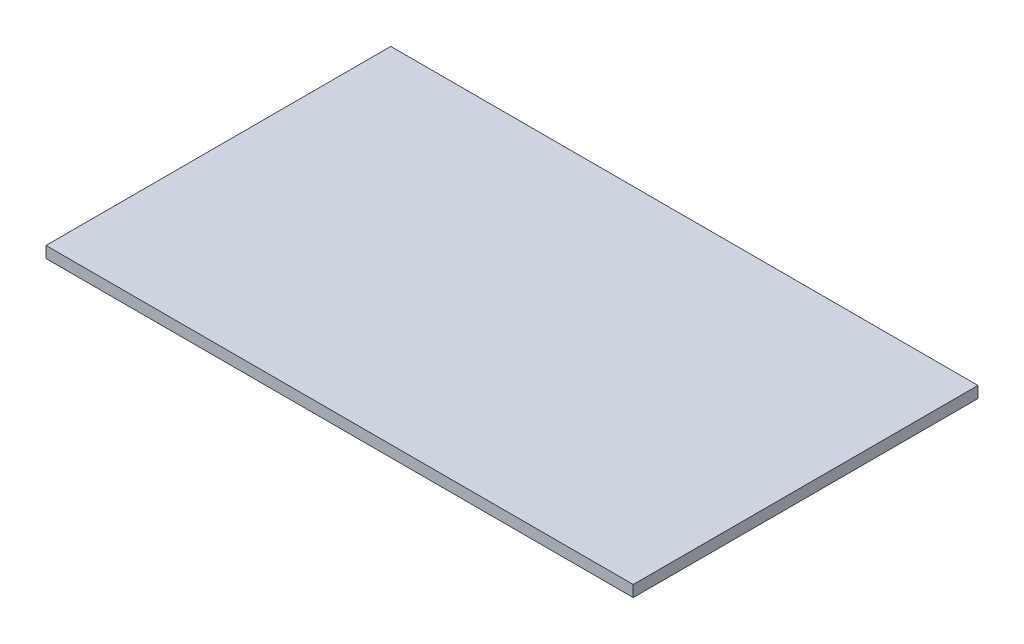
ISO-10303-21;
HEADER;
FILE_DESCRIPTION(('STEP AP214'),'2;1');
FILE_NAME('part.step','',(''),(''),'','','');
FILE_SCHEMA(('AUTOMOTIVE_DESIGN { 1 0 10303 214 1 1 1 1 }'));
ENDSEC;
DATA;
#1=APPLICATION_CONTEXT('core data for automotive mechanical design processes');
#2=APPLICATION_PROTOCOL_DEFINITION('international standard','automotive_design',2000,#1);
#3=PRODUCT_CONTEXT('',#1,'mechanical');
#4=PRODUCT('Part','Part','',(#3));
#5=PRODUCT_RELATED_PRODUCT_CATEGORY('part','',(#4));
#6=PRODUCT_DEFINITION_FORMATION('','',#4);
#7=PRODUCT_DEFINITION_CONTEXT('part definition',#1,'design');
#8=PRODUCT_DEFINITION('design','',#6,#7);
#9=PRODUCT_DEFINITION_SHAPE('','',#8);
#10=(LENGTH_UNIT() NAMED_UNIT(*) SI_UNIT(.MILLI.,.METRE.));
#11=(NAMED_UNIT(*) PLANE_ANGLE_UNIT() SI_UNIT($,.RADIAN.));
#12=(NAMED_UNIT(*) SI_UNIT($,.STERADIAN.) SOLID_ANGLE_UNIT());
#13=UNCERTAINTY_MEASURE_WITH_UNIT(LENGTH_MEASURE(1.E-05),#10,'distance_accuracy_value','');
#14=(GEOMETRIC_REPRESENTATION_CONTEXT(3) GLOBAL_UNCERTAINTY_ASSIGNED_CONTEXT((#13)) GLOBAL_UNIT_ASSIGNED_CONTEXT((#10,
#11,#12)) REPRESENTATION_CONTEXT('',''));
#15=CARTESIAN_POINT('',(0.,0.,0.));
#16=DIRECTION('',(0.,0.,1.));
#17=DIRECTION('',(1.,0.,0.));
#18=AXIS2_PLACEMENT_3D('',#15,#16,#17);
#19=CARTESIAN_POINT('',(0.,19.05,0.));
#20=DIRECTION('',(1.,0.,0.));
#21=DIRECTION('',(0.,0.,-1.));
#22=AXIS2_PLACEMENT_3D('',#19,#20,#21);
#23=PLANE('',#22);
#24=DIRECTION('',(0.,0.,1.));
#25=VECTOR('',#24,1.);
#26=CARTESIAN_POINT('',(0.,0.,0.));
#27=LINE('',#26,#25);
#28=CARTESIAN_POINT('',(-1.11022302462516E-13,0.,-577.85));
#29=VERTEX_POINT('',#28);
#30=CARTESIAN_POINT('',(0.,0.,0.));
#31=VERTEX_POINT('',#30);
#32=EDGE_CURVE('E96',#29,#31,#27,.T.);
#33=ORIENTED_EDGE('',*,*,#32,.T.);
#34=DIRECTION('',(0.,-1.,0.));
#35=VECTOR('',#34,1.);
#36=CARTESIAN_POINT('',(0.,19.05,0.));
#37=LINE('',#36,#35);
#38=CARTESIAN_POINT('',(0.,19.05,0.));
#39=VERTEX_POINT('',#38);
#40=EDGE_CURVE('E11',#39,#31,#37,.T.);
#41=ORIENTED_EDGE('',*,*,#40,.F.);
#42=DIRECTION('',(0.,0.,1.));
#43=VECTOR('',#42,1.);
#44=CARTESIAN_POINT('',(0.,19.05,0.));
#45=LINE('',#44,#43);
#46=CARTESIAN_POINT('',(-1.11022302462516E-13,19.05,-577.85));
#47=VERTEX_POINT('',#46);
#48=EDGE_CURVE('E84',#47,#39,#45,.T.);
#49=ORIENTED_EDGE('',*,*,#48,.F.);
#50=DIRECTION('',(0.,-1.,0.));
#51=VECTOR('',#50,1.);
#52=CARTESIAN_POINT('',(-1.11022302462516E-13,19.05,-577.85));
#53=LINE('',#52,#51);
#54=EDGE_CURVE('E92',#47,#29,#53,.T.);
#55=ORIENTED_EDGE('',*,*,#54,.T.);
#56=EDGE_LOOP('',(#33,#41,#49,#55));
#57=FACE_BOUND('',#56,.T.);
#58=ADVANCED_FACE('F33',(#57),#23,.F.);
#59=CARTESIAN_POINT('',(0.,19.05,0.));
#60=DIRECTION('',(0.,0.,-1.));
#61=DIRECTION('',(-1.,0.,0.));
#62=AXIS2_PLACEMENT_3D('',#59,#60,#61);
#63=PLANE('',#62);
#64=DIRECTION('',(1.,0.,0.));
#65=VECTOR('',#64,1.);
#66=CARTESIAN_POINT('',(0.,0.,0.));
#67=LINE('',#66,#65);
#68=CARTESIAN_POINT('',(984.25,0.,0.));
#69=VERTEX_POINT('',#68);
#70=EDGE_CURVE('E88',#31,#69,#67,.T.);
#71=ORIENTED_EDGE('',*,*,#70,.T.);
#72=DIRECTION('',(0.,-1.,0.));
#73=VECTOR('',#72,1.);
#74=CARTESIAN_POINT('',(984.25,19.05,0.));
#75=LINE('',#74,#73);
#76=CARTESIAN_POINT('',(984.25,19.05,0.));
#77=VERTEX_POINT('',#76);
#78=EDGE_CURVE('E41',#77,#69,#75,.T.);
#79=ORIENTED_EDGE('',*,*,#78,.F.);
#80=DIRECTION('',(1.,0.,0.));
#81=VECTOR('',#80,1.);
#82=CARTESIAN_POINT('',(0.,19.05,0.));
#83=LINE('',#82,#81);
#84=EDGE_CURVE('E79',#39,#77,#83,.T.);
#85=ORIENTED_EDGE('',*,*,#84,.F.);
#86=ORIENTED_EDGE('',*,*,#40,.T.);
#87=EDGE_LOOP('',(#71,#79,#85,#86));
#88=FACE_BOUND('',#87,.T.);
#89=ADVANCED_FACE('F87',(#88),#63,.F.);
#90=CARTESIAN_POINT('',(984.25,19.05,0.));
#91=DIRECTION('',(-1.,0.,0.));
#92=DIRECTION('',(0.,0.,1.));
#93=AXIS2_PLACEMENT_3D('',#90,#91,#92);
#94=PLANE('',#93);
#95=DIRECTION('',(0.,0.,-1.));
#96=VECTOR('',#95,1.);
#97=CARTESIAN_POINT('',(984.25,0.,0.));
#98=LINE('',#97,#96);
#99=CARTESIAN_POINT('',(984.25,0.,-577.85));
#100=VERTEX_POINT('',#99);
#101=EDGE_CURVE('E66',#69,#100,#98,.T.);
#102=ORIENTED_EDGE('',*,*,#101,.T.);
#103=DIRECTION('',(0.,-1.,0.));
#104=VECTOR('',#103,1.);
#105=CARTESIAN_POINT('',(984.25,19.05,-577.85));
#106=LINE('',#105,#104);
#107=CARTESIAN_POINT('',(984.25,19.05,-577.85));
#108=VERTEX_POINT('',#107);
#109=EDGE_CURVE('E89',#108,#100,#106,.T.);
#110=ORIENTED_EDGE('',*,*,#109,.F.);
#111=DIRECTION('',(0.,0.,-1.));
#112=VECTOR('',#111,1.);
#113=CARTESIAN_POINT('',(984.25,19.05,0.));
#114=LINE('',#113,#112);
#115=EDGE_CURVE('E82',#77,#108,#114,.T.);
#116=ORIENTED_EDGE('',*,*,#115,.F.);
#117=ORIENTED_EDGE('',*,*,#78,.T.);
#118=EDGE_LOOP('',(#102,#110,#116,#117));
#119=FACE_BOUND('',#118,.T.);
#120=ADVANCED_FACE('F90',(#119),#94,.F.);
#121=CARTESIAN_POINT('',(-1.11022302462516E-13,19.05,-577.85));
#122=DIRECTION('',(0.,0.,1.));
#123=DIRECTION('',(1.,0.,0.));
#124=AXIS2_PLACEMENT_3D('',#121,#122,#123);
#125=PLANE('',#124);
#126=DIRECTION('',(-1.,0.,0.));
#127=VECTOR('',#126,1.);
#128=CARTESIAN_POINT('',(-1.11022302462516E-13,0.,-577.85));
#129=LINE('',#128,#127);
#130=EDGE_CURVE('E72',#100,#29,#129,.T.);
#131=ORIENTED_EDGE('',*,*,#130,.T.);
#132=ORIENTED_EDGE('',*,*,#54,.F.);
#133=DIRECTION('',(-1.,0.,0.));
#134=VECTOR('',#133,1.);
#135=CARTESIAN_POINT('',(-1.11022302462516E-13,19.05,-577.85));
#136=LINE('',#135,#134);
#137=EDGE_CURVE('E49',#108,#47,#136,.T.);
#138=ORIENTED_EDGE('',*,*,#137,.F.);
#139=ORIENTED_EDGE('',*,*,#109,.T.);
#140=EDGE_LOOP('',(#131,#132,#138,#139));
#141=FACE_BOUND('',#140,.T.);
#142=ADVANCED_FACE('F103',(#141),#125,.F.);
#143=CARTESIAN_POINT('',(0.,19.05,0.));
#144=DIRECTION('',(0.,-1.,0.));
#145=DIRECTION('',(0.,0.,-1.));
#146=AXIS2_PLACEMENT_3D('',#143,#144,#145);
#147=PLANE('',#146);
#148=ORIENTED_EDGE('',*,*,#48,.T.);
#149=ORIENTED_EDGE('',*,*,#84,.T.);
#150=ORIENTED_EDGE('',*,*,#115,.T.);
#151=ORIENTED_EDGE('',*,*,#137,.T.);
#152=EDGE_LOOP('',(#148,#149,#150,#151));
#153=FACE_BOUND('',#152,.T.);
#154=ADVANCED_FACE('F80',(#153),#147,.F.);
#155=CARTESIAN_POINT('',(0.,0.,0.));
#156=DIRECTION('',(0.,-1.,0.));
#157=DIRECTION('',(0.,0.,-1.));
#158=AXIS2_PLACEMENT_3D('',#155,#156,#157);
#159=PLANE('',#158);
#160=ORIENTED_EDGE('',*,*,#32,.F.);
#161=ORIENTED_EDGE('',*,*,#130,.F.);
#162=ORIENTED_EDGE('',*,*,#101,.F.);
#163=ORIENTED_EDGE('',*,*,#70,.F.);
#164=EDGE_LOOP('',(#160,#161,#162,#163));
#165=FACE_BOUND('',#164,.T.);
#166=ADVANCED_FACE('F106',(#165),#159,.T.);
#167=CLOSED_SHELL('',(#58,#89,#120,#142,#154,#166));
#168=MANIFOLD_SOLID_BREP('B2',#167);
#169=ADVANCED_BREP_SHAPE_REPRESENTATION('',(#18,#168),#14);
#170=SHAPE_DEFINITION_REPRESENTATION(#9,#169);
ENDSEC;
END-ISO-10303-21;
